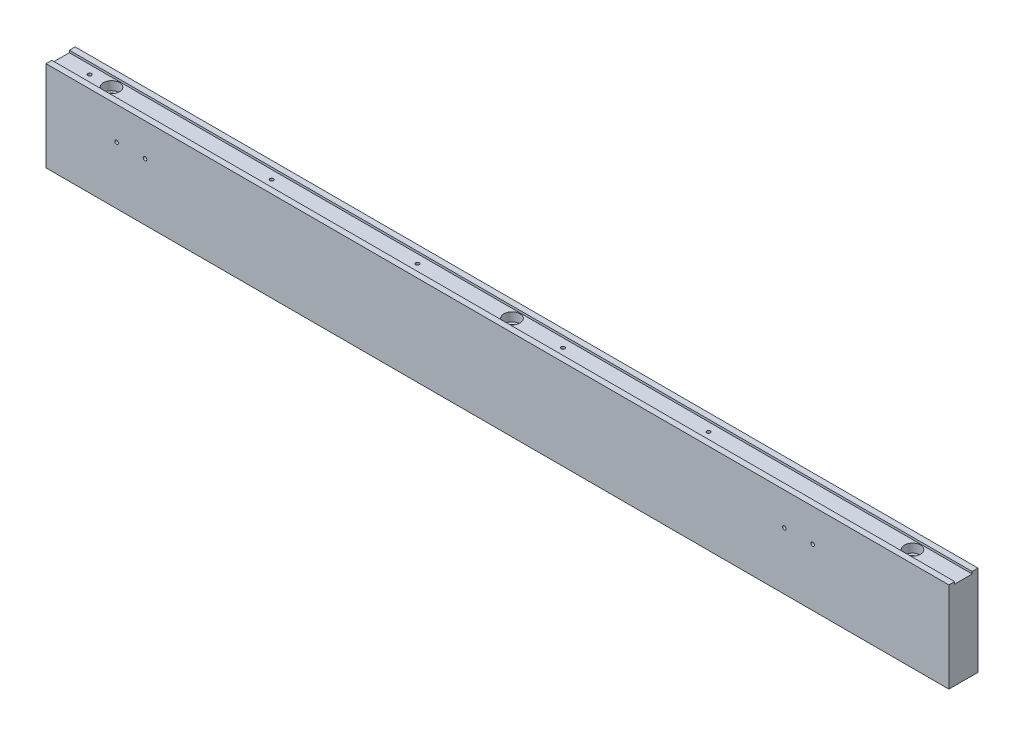
ISO-10303-21;
HEADER;
FILE_DESCRIPTION(('STEP AP214'),'2;1');
FILE_NAME('part.step','',(''),(''),'','','');
FILE_SCHEMA(('AUTOMOTIVE_DESIGN { 1 0 10303 214 1 1 1 1 }'));
ENDSEC;
DATA;
#1=APPLICATION_CONTEXT('core data for automotive mechanical design processes');
#2=APPLICATION_PROTOCOL_DEFINITION('international standard','automotive_design',2000,#1);
#3=PRODUCT_CONTEXT('',#1,'mechanical');
#4=PRODUCT('Part','Part','',(#3));
#5=PRODUCT_RELATED_PRODUCT_CATEGORY('part','',(#4));
#6=PRODUCT_DEFINITION_FORMATION('','',#4);
#7=PRODUCT_DEFINITION_CONTEXT('part definition',#1,'design');
#8=PRODUCT_DEFINITION('design','',#6,#7);
#9=PRODUCT_DEFINITION_SHAPE('','',#8);
#10=(LENGTH_UNIT() NAMED_UNIT(*) SI_UNIT(.MILLI.,.METRE.));
#11=(NAMED_UNIT(*) PLANE_ANGLE_UNIT() SI_UNIT($,.RADIAN.));
#12=(NAMED_UNIT(*) SI_UNIT($,.STERADIAN.) SOLID_ANGLE_UNIT());
#13=UNCERTAINTY_MEASURE_WITH_UNIT(LENGTH_MEASURE(1.E-05),#10,'distance_accuracy_value','');
#14=(GEOMETRIC_REPRESENTATION_CONTEXT(3) GLOBAL_UNCERTAINTY_ASSIGNED_CONTEXT((#13)) GLOBAL_UNIT_ASSIGNED_CONTEXT((#10,
#11,#12)) REPRESENTATION_CONTEXT('',''));
#15=CARTESIAN_POINT('',(0.,0.,0.));
#16=DIRECTION('',(0.,0.,1.));
#17=DIRECTION('',(1.,0.,0.));
#18=AXIS2_PLACEMENT_3D('',#15,#16,#17);
#19=CARTESIAN_POINT('',(0.,62.,20.));
#20=DIRECTION('',(0.,-1.,0.));
#21=DIRECTION('',(0.,0.,-1.));
#22=AXIS2_PLACEMENT_3D('',#19,#20,#21);
#23=PLANE('',#22);
#24=DIRECTION('',(0.,0.,-1.));
#25=VECTOR('',#24,1.);
#26=CARTESIAN_POINT('',(0.,62.,20.));
#27=LINE('',#26,#25);
#28=CARTESIAN_POINT('',(0.,62.,4.));
#29=VERTEX_POINT('',#28);
#30=CARTESIAN_POINT('',(0.,62.,0.));
#31=VERTEX_POINT('',#30);
#32=EDGE_CURVE('E83',#29,#31,#27,.T.);
#33=ORIENTED_EDGE('',*,*,#32,.F.);
#34=DIRECTION('',(1.,0.,0.));
#35=VECTOR('',#34,1.);
#36=CARTESIAN_POINT('',(0.,62.,4.));
#37=LINE('',#36,#35);
#38=CARTESIAN_POINT('',(620.,62.,4.));
#39=VERTEX_POINT('',#38);
#40=EDGE_CURVE('E244',#29,#39,#37,.T.);
#41=ORIENTED_EDGE('',*,*,#40,.T.);
#42=DIRECTION('',(0.,0.,-1.));
#43=VECTOR('',#42,1.);
#44=CARTESIAN_POINT('',(620.,62.,20.));
#45=LINE('',#44,#43);
#46=CARTESIAN_POINT('',(620.,62.,0.));
#47=VERTEX_POINT('',#46);
#48=EDGE_CURVE('E277',#39,#47,#45,.T.);
#49=ORIENTED_EDGE('',*,*,#48,.T.);
#50=DIRECTION('',(-1.,0.,0.));
#51=VECTOR('',#50,1.);
#52=CARTESIAN_POINT('',(0.,62.,0.));
#53=LINE('',#52,#51);
#54=EDGE_CURVE('E262',#47,#31,#53,.T.);
#55=ORIENTED_EDGE('',*,*,#54,.T.);
#56=EDGE_LOOP('',(#33,#41,#49,#55));
#57=FACE_BOUND('',#56,.T.);
#58=ADVANCED_FACE('F37',(#57),#23,.F.);
#59=CARTESIAN_POINT('',(0.,0.,20.));
#60=DIRECTION('',(1.,0.,0.));
#61=DIRECTION('',(0.,0.,-1.));
#62=AXIS2_PLACEMENT_3D('',#59,#60,#61);
#63=PLANE('',#62);
#64=DIRECTION('',(0.,0.,-1.));
#65=VECTOR('',#64,1.);
#66=CARTESIAN_POINT('',(0.,60.5,4.));
#67=LINE('',#66,#65);
#68=CARTESIAN_POINT('',(0.,60.5,16.));
#69=VERTEX_POINT('',#68);
#70=CARTESIAN_POINT('',(0.,60.5,4.));
#71=VERTEX_POINT('',#70);
#72=EDGE_CURVE('E241',#69,#71,#67,.T.);
#73=ORIENTED_EDGE('',*,*,#72,.T.);
#74=DIRECTION('',(0.,1.,0.));
#75=VECTOR('',#74,1.);
#76=CARTESIAN_POINT('',(0.,62.,4.));
#77=LINE('',#76,#75);
#78=EDGE_CURVE('E237',#71,#29,#77,.T.);
#79=ORIENTED_EDGE('',*,*,#78,.T.);
#80=ORIENTED_EDGE('',*,*,#32,.T.);
#81=DIRECTION('',(0.,-1.,0.));
#82=VECTOR('',#81,1.);
#83=CARTESIAN_POINT('',(0.,0.,0.));
#84=LINE('',#83,#82);
#85=CARTESIAN_POINT('',(0.,0.,0.));
#86=VERTEX_POINT('',#85);
#87=EDGE_CURVE('E253',#31,#86,#84,.T.);
#88=ORIENTED_EDGE('',*,*,#87,.T.);
#89=DIRECTION('',(0.,0.,-1.));
#90=VECTOR('',#89,1.);
#91=CARTESIAN_POINT('',(0.,0.,20.));
#92=LINE('',#91,#90);
#93=CARTESIAN_POINT('',(0.,0.,20.));
#94=VERTEX_POINT('',#93);
#95=EDGE_CURVE('E11',#94,#86,#92,.T.);
#96=ORIENTED_EDGE('',*,*,#95,.F.);
#97=DIRECTION('',(0.,-1.,0.));
#98=VECTOR('',#97,1.);
#99=CARTESIAN_POINT('',(0.,0.,20.));
#100=LINE('',#99,#98);
#101=CARTESIAN_POINT('',(0.,62.,20.));
#102=VERTEX_POINT('',#101);
#103=EDGE_CURVE('E260',#102,#94,#100,.T.);
#104=ORIENTED_EDGE('',*,*,#103,.F.);
#105=CARTESIAN_POINT('',(0.,62.,16.));
#106=VERTEX_POINT('',#105);
#107=EDGE_CURVE('E274',#102,#106,#27,.T.);
#108=ORIENTED_EDGE('',*,*,#107,.T.);
#109=DIRECTION('',(0.,-1.,0.));
#110=VECTOR('',#109,1.);
#111=CARTESIAN_POINT('',(0.,62.,16.));
#112=LINE('',#111,#110);
#113=EDGE_CURVE('E52',#106,#69,#112,.T.);
#114=ORIENTED_EDGE('',*,*,#113,.T.);
#115=EDGE_LOOP('',(#73,#79,#80,#88,#96,#104,#108,#114));
#116=FACE_BOUND('',#115,.T.);
#117=ADVANCED_FACE('F39',(#116),#63,.F.);
#118=CARTESIAN_POINT('',(0.,0.,20.));
#119=DIRECTION('',(0.,1.,0.));
#120=DIRECTION('',(0.,0.,1.));
#121=AXIS2_PLACEMENT_3D('',#118,#119,#120);
#122=PLANE('',#121);
#123=CARTESIAN_POINT('',(35.,0.,10.));
#124=DIRECTION('',(0.,1.,0.));
#125=DIRECTION('',(0.,0.,1.));
#126=AXIS2_PLACEMENT_3D('',#123,#124,#125);
#127=CIRCLE('',#126,3.49999999999998);
#128=CARTESIAN_POINT('',(35.,0.,13.5));
#129=VERTEX_POINT('',#128);
#130=EDGE_CURVE('E209',#129,#129,#127,.T.);
#131=ORIENTED_EDGE('',*,*,#130,.T.);
#132=EDGE_LOOP('',(#131));
#133=FACE_BOUND('',#132,.T.);
#134=CARTESIAN_POINT('',(310.,0.,10.));
#135=DIRECTION('',(0.,1.,0.));
#136=DIRECTION('',(0.,0.,1.));
#137=AXIS2_PLACEMENT_3D('',#134,#135,#136);
#138=CIRCLE('',#137,3.5);
#139=CARTESIAN_POINT('',(310.,0.,13.5));
#140=VERTEX_POINT('',#139);
#141=EDGE_CURVE('E221',#140,#140,#138,.T.);
#142=ORIENTED_EDGE('',*,*,#141,.T.);
#143=EDGE_LOOP('',(#142));
#144=FACE_BOUND('',#143,.T.);
#145=CARTESIAN_POINT('',(585.,0.,9.99999999999993));
#146=DIRECTION('',(0.,1.,0.));
#147=DIRECTION('',(0.,0.,1.));
#148=AXIS2_PLACEMENT_3D('',#145,#146,#147);
#149=CIRCLE('',#148,3.49999999999995);
#150=CARTESIAN_POINT('',(585.,0.,13.4999999999999));
#151=VERTEX_POINT('',#150);
#152=EDGE_CURVE('E233',#151,#151,#149,.T.);
#153=ORIENTED_EDGE('',*,*,#152,.T.);
#154=EDGE_LOOP('',(#153));
#155=FACE_BOUND('',#154,.T.);
#156=DIRECTION('',(1.,0.,0.));
#157=VECTOR('',#156,1.);
#158=CARTESIAN_POINT('',(0.,0.,0.));
#159=LINE('',#158,#157);
#160=CARTESIAN_POINT('',(620.,0.,0.));
#161=VERTEX_POINT('',#160);
#162=EDGE_CURVE('E268',#86,#161,#159,.T.);
#163=ORIENTED_EDGE('',*,*,#162,.T.);
#164=DIRECTION('',(0.,0.,-1.));
#165=VECTOR('',#164,1.);
#166=CARTESIAN_POINT('',(620.,0.,20.));
#167=LINE('',#166,#165);
#168=CARTESIAN_POINT('',(620.,0.,20.));
#169=VERTEX_POINT('',#168);
#170=EDGE_CURVE('E45',#169,#161,#167,.T.);
#171=ORIENTED_EDGE('',*,*,#170,.F.);
#172=DIRECTION('',(1.,0.,0.));
#173=VECTOR('',#172,1.);
#174=CARTESIAN_POINT('',(0.,0.,20.));
#175=LINE('',#174,#173);
#176=EDGE_CURVE('E90',#94,#169,#175,.T.);
#177=ORIENTED_EDGE('',*,*,#176,.F.);
#178=ORIENTED_EDGE('',*,*,#95,.T.);
#179=EDGE_LOOP('',(#163,#171,#177,#178));
#180=FACE_BOUND('',#179,.T.);
#181=ADVANCED_FACE('F325',(#133,#144,#155,#180),#122,.F.);
#182=CARTESIAN_POINT('',(620.,0.,20.));
#183=DIRECTION('',(-1.,0.,0.));
#184=DIRECTION('',(0.,0.,1.));
#185=AXIS2_PLACEMENT_3D('',#182,#183,#184);
#186=PLANE('',#185);
#187=ORIENTED_EDGE('',*,*,#48,.F.);
#188=DIRECTION('',(0.,1.,0.));
#189=VECTOR('',#188,1.);
#190=CARTESIAN_POINT('',(620.,62.,4.));
#191=LINE('',#190,#189);
#192=CARTESIAN_POINT('',(620.,60.5,4.));
#193=VERTEX_POINT('',#192);
#194=EDGE_CURVE('E236',#193,#39,#191,.T.);
#195=ORIENTED_EDGE('',*,*,#194,.F.);
#196=DIRECTION('',(0.,0.,-1.));
#197=VECTOR('',#196,1.);
#198=CARTESIAN_POINT('',(620.,60.5,4.));
#199=LINE('',#198,#197);
#200=CARTESIAN_POINT('',(620.,60.5,16.));
#201=VERTEX_POINT('',#200);
#202=EDGE_CURVE('E239',#201,#193,#199,.T.);
#203=ORIENTED_EDGE('',*,*,#202,.F.);
#204=DIRECTION('',(0.,-1.,0.));
#205=VECTOR('',#204,1.);
#206=CARTESIAN_POINT('',(620.,62.,16.));
#207=LINE('',#206,#205);
#208=CARTESIAN_POINT('',(620.,62.,16.));
#209=VERTEX_POINT('',#208);
#210=EDGE_CURVE('E246',#209,#201,#207,.T.);
#211=ORIENTED_EDGE('',*,*,#210,.F.);
#212=CARTESIAN_POINT('',(620.,62.,20.));
#213=VERTEX_POINT('',#212);
#214=EDGE_CURVE('E278',#213,#209,#45,.T.);
#215=ORIENTED_EDGE('',*,*,#214,.F.);
#216=DIRECTION('',(0.,1.,0.));
#217=VECTOR('',#216,1.);
#218=CARTESIAN_POINT('',(620.,0.,20.));
#219=LINE('',#218,#217);
#220=EDGE_CURVE('E264',#169,#213,#219,.T.);
#221=ORIENTED_EDGE('',*,*,#220,.F.);
#222=ORIENTED_EDGE('',*,*,#170,.T.);
#223=DIRECTION('',(0.,1.,0.));
#224=VECTOR('',#223,1.);
#225=CARTESIAN_POINT('',(620.,0.,0.));
#226=LINE('',#225,#224);
#227=EDGE_CURVE('E270',#161,#47,#226,.T.);
#228=ORIENTED_EDGE('',*,*,#227,.T.);
#229=EDGE_LOOP('',(#187,#195,#203,#211,#215,#221,#222,#228));
#230=FACE_BOUND('',#229,.T.);
#231=ADVANCED_FACE('F285',(#230),#186,.F.);
#232=ORIENTED_EDGE('',*,*,#214,.T.);
#233=DIRECTION('',(1.,0.,0.));
#234=VECTOR('',#233,1.);
#235=CARTESIAN_POINT('',(0.,62.,16.));
#236=LINE('',#235,#234);
#237=EDGE_CURVE('E256',#106,#209,#236,.T.);
#238=ORIENTED_EDGE('',*,*,#237,.F.);
#239=ORIENTED_EDGE('',*,*,#107,.F.);
#240=DIRECTION('',(-1.,0.,0.));
#241=VECTOR('',#240,1.);
#242=CARTESIAN_POINT('',(0.,62.,20.));
#243=LINE('',#242,#241);
#244=EDGE_CURVE('E61',#213,#102,#243,.T.);
#245=ORIENTED_EDGE('',*,*,#244,.F.);
#246=EDGE_LOOP('',(#232,#238,#239,#245));
#247=FACE_BOUND('',#246,.T.);
#248=ADVANCED_FACE('F303',(#247),#23,.F.);
#249=CARTESIAN_POINT('',(0.,62.,20.));
#250=DIRECTION('',(0.,0.,-1.));
#251=DIRECTION('',(-1.,0.,0.));
#252=AXIS2_PLACEMENT_3D('',#249,#250,#251);
#253=PLANE('',#252);
#254=CARTESIAN_POINT('',(48.5,39.5,20.));
#255=DIRECTION('',(0.,0.,1.));
#256=DIRECTION('',(1.,0.,0.));
#257=AXIS2_PLACEMENT_3D('',#254,#255,#256);
#258=CIRCLE('',#257,1.25);
#259=CARTESIAN_POINT('',(49.75,39.5,20.));
#260=VERTEX_POINT('',#259);
#261=EDGE_CURVE('E148',#260,#260,#258,.T.);
#262=ORIENTED_EDGE('',*,*,#261,.F.);
#263=EDGE_LOOP('',(#262));
#264=FACE_BOUND('',#263,.T.);
#265=CARTESIAN_POINT('',(68.,39.5,20.));
#266=DIRECTION('',(0.,0.,1.));
#267=DIRECTION('',(1.,0.,0.));
#268=AXIS2_PLACEMENT_3D('',#265,#266,#267);
#269=CIRCLE('',#268,1.25);
#270=CARTESIAN_POINT('',(69.25,39.5,20.));
#271=VERTEX_POINT('',#270);
#272=EDGE_CURVE('E147',#271,#271,#269,.T.);
#273=ORIENTED_EDGE('',*,*,#272,.F.);
#274=EDGE_LOOP('',(#273));
#275=FACE_BOUND('',#274,.T.);
#276=CARTESIAN_POINT('',(507.,39.5,20.));
#277=DIRECTION('',(0.,0.,1.));
#278=DIRECTION('',(1.,0.,0.));
#279=AXIS2_PLACEMENT_3D('',#276,#277,#278);
#280=CIRCLE('',#279,1.24999999999997);
#281=CARTESIAN_POINT('',(508.25,39.5,20.));
#282=VERTEX_POINT('',#281);
#283=EDGE_CURVE('E158',#282,#282,#280,.T.);
#284=ORIENTED_EDGE('',*,*,#283,.F.);
#285=EDGE_LOOP('',(#284));
#286=FACE_BOUND('',#285,.T.);
#287=CARTESIAN_POINT('',(526.5,39.5,20.));
#288=DIRECTION('',(0.,0.,1.));
#289=DIRECTION('',(1.,0.,0.));
#290=AXIS2_PLACEMENT_3D('',#287,#288,#289);
#291=CIRCLE('',#290,1.24999999999997);
#292=CARTESIAN_POINT('',(527.75,39.5,20.));
#293=VERTEX_POINT('',#292);
#294=EDGE_CURVE('E164',#293,#293,#291,.T.);
#295=ORIENTED_EDGE('',*,*,#294,.F.);
#296=EDGE_LOOP('',(#295));
#297=FACE_BOUND('',#296,.T.);
#298=ORIENTED_EDGE('',*,*,#103,.T.);
#299=ORIENTED_EDGE('',*,*,#176,.T.);
#300=ORIENTED_EDGE('',*,*,#220,.T.);
#301=ORIENTED_EDGE('',*,*,#244,.T.);
#302=EDGE_LOOP('',(#298,#299,#300,#301));
#303=FACE_BOUND('',#302,.T.);
#304=ADVANCED_FACE('F306',(#264,#275,#286,#297,#303),#253,.F.);
#305=CARTESIAN_POINT('',(0.,62.,0.));
#306=DIRECTION('',(0.,0.,-1.));
#307=DIRECTION('',(-1.,0.,0.));
#308=AXIS2_PLACEMENT_3D('',#305,#306,#307);
#309=PLANE('',#308);
#310=ORIENTED_EDGE('',*,*,#87,.F.);
#311=ORIENTED_EDGE('',*,*,#54,.F.);
#312=ORIENTED_EDGE('',*,*,#227,.F.);
#313=ORIENTED_EDGE('',*,*,#162,.F.);
#314=EDGE_LOOP('',(#310,#311,#312,#313));
#315=FACE_BOUND('',#314,.T.);
#316=ADVANCED_FACE('F290',(#315),#309,.T.);
#317=CARTESIAN_POINT('',(0.,62.,4.));
#318=DIRECTION('',(0.,0.,-1.));
#319=DIRECTION('',(0.,1.,0.));
#320=AXIS2_PLACEMENT_3D('',#317,#318,#319);
#321=PLANE('',#320);
#322=ORIENTED_EDGE('',*,*,#194,.T.);
#323=ORIENTED_EDGE('',*,*,#40,.F.);
#324=ORIENTED_EDGE('',*,*,#78,.F.);
#325=DIRECTION('',(1.,0.,0.));
#326=VECTOR('',#325,1.);
#327=CARTESIAN_POINT('',(0.,60.5,4.));
#328=LINE('',#327,#326);
#329=EDGE_CURVE('E251',#71,#193,#328,.T.);
#330=ORIENTED_EDGE('',*,*,#329,.T.);
#331=EDGE_LOOP('',(#322,#323,#324,#330));
#332=FACE_BOUND('',#331,.T.);
#333=ADVANCED_FACE('F296',(#332),#321,.F.);
#334=CARTESIAN_POINT('',(0.,60.5,4.));
#335=DIRECTION('',(0.,-1.,0.));
#336=DIRECTION('',(0.,0.,-1.));
#337=AXIS2_PLACEMENT_3D('',#334,#335,#336);
#338=PLANE('',#337);
#339=CARTESIAN_POINT('',(19.9999999999999,60.5,10.));
#340=DIRECTION('',(0.,1.,0.));
#341=DIRECTION('',(0.,0.,1.));
#342=AXIS2_PLACEMENT_3D('',#339,#340,#341);
#343=CIRCLE('',#342,1.25);
#344=CARTESIAN_POINT('',(19.9999999999999,60.5,11.25));
#345=VERTEX_POINT('',#344);
#346=EDGE_CURVE('E170',#345,#345,#343,.T.);
#347=ORIENTED_EDGE('',*,*,#346,.F.);
#348=EDGE_LOOP('',(#347));
#349=FACE_BOUND('',#348,.T.);
#350=CARTESIAN_POINT('',(445.,60.5,10.));
#351=DIRECTION('',(0.,1.,0.));
#352=DIRECTION('',(0.,0.,1.));
#353=AXIS2_PLACEMENT_3D('',#350,#351,#352);
#354=CIRCLE('',#353,1.24999999999997);
#355=CARTESIAN_POINT('',(445.,60.5,11.25));
#356=VERTEX_POINT('',#355);
#357=EDGE_CURVE('E176',#356,#356,#354,.T.);
#358=ORIENTED_EDGE('',*,*,#357,.F.);
#359=EDGE_LOOP('',(#358));
#360=FACE_BOUND('',#359,.T.);
#361=CARTESIAN_POINT('',(345.,60.5,10.));
#362=DIRECTION('',(0.,1.,0.));
#363=DIRECTION('',(0.,0.,1.));
#364=AXIS2_PLACEMENT_3D('',#361,#362,#363);
#365=CIRCLE('',#364,1.24999999999997);
#366=CARTESIAN_POINT('',(345.,60.5,11.25));
#367=VERTEX_POINT('',#366);
#368=EDGE_CURVE('E182',#367,#367,#365,.T.);
#369=ORIENTED_EDGE('',*,*,#368,.F.);
#370=EDGE_LOOP('',(#369));
#371=FACE_BOUND('',#370,.T.);
#372=CARTESIAN_POINT('',(245.,60.5,10.));
#373=DIRECTION('',(0.,1.,0.));
#374=DIRECTION('',(0.,0.,1.));
#375=AXIS2_PLACEMENT_3D('',#372,#373,#374);
#376=CIRCLE('',#375,1.25);
#377=CARTESIAN_POINT('',(245.,60.5,11.25));
#378=VERTEX_POINT('',#377);
#379=EDGE_CURVE('E188',#378,#378,#376,.T.);
#380=ORIENTED_EDGE('',*,*,#379,.F.);
#381=EDGE_LOOP('',(#380));
#382=FACE_BOUND('',#381,.T.);
#383=CARTESIAN_POINT('',(145.,60.5,10.));
#384=DIRECTION('',(0.,1.,0.));
#385=DIRECTION('',(0.,0.,1.));
#386=AXIS2_PLACEMENT_3D('',#383,#384,#385);
#387=CIRCLE('',#386,1.25);
#388=CARTESIAN_POINT('',(145.,60.5,11.25));
#389=VERTEX_POINT('',#388);
#390=EDGE_CURVE('E194',#389,#389,#387,.T.);
#391=ORIENTED_EDGE('',*,*,#390,.F.);
#392=EDGE_LOOP('',(#391));
#393=FACE_BOUND('',#392,.T.);
#394=CARTESIAN_POINT('',(35.,60.5,10.));
#395=DIRECTION('',(0.,1.,0.));
#396=DIRECTION('',(0.,0.,1.));
#397=AXIS2_PLACEMENT_3D('',#394,#395,#396);
#398=CIRCLE('',#397,5.5);
#399=CARTESIAN_POINT('',(35.,60.5,15.5));
#400=VERTEX_POINT('',#399);
#401=EDGE_CURVE('E200',#400,#400,#398,.T.);
#402=ORIENTED_EDGE('',*,*,#401,.F.);
#403=EDGE_LOOP('',(#402));
#404=FACE_BOUND('',#403,.T.);
#405=CARTESIAN_POINT('',(310.,60.5,10.));
#406=DIRECTION('',(0.,1.,0.));
#407=DIRECTION('',(0.,0.,1.));
#408=AXIS2_PLACEMENT_3D('',#405,#406,#407);
#409=CIRCLE('',#408,5.50000000000001);
#410=CARTESIAN_POINT('',(310.,60.5,15.5));
#411=VERTEX_POINT('',#410);
#412=EDGE_CURVE('E212',#411,#411,#409,.T.);
#413=ORIENTED_EDGE('',*,*,#412,.F.);
#414=EDGE_LOOP('',(#413));
#415=FACE_BOUND('',#414,.T.);
#416=CARTESIAN_POINT('',(585.,60.5,9.99999999999993));
#417=DIRECTION('',(0.,1.,0.));
#418=DIRECTION('',(0.,0.,1.));
#419=AXIS2_PLACEMENT_3D('',#416,#417,#418);
#420=CIRCLE('',#419,5.49999999999995);
#421=CARTESIAN_POINT('',(585.,60.5,15.4999999999999));
#422=VERTEX_POINT('',#421);
#423=EDGE_CURVE('E224',#422,#422,#420,.T.);
#424=ORIENTED_EDGE('',*,*,#423,.F.);
#425=EDGE_LOOP('',(#424));
#426=FACE_BOUND('',#425,.T.);
#427=ORIENTED_EDGE('',*,*,#202,.T.);
#428=ORIENTED_EDGE('',*,*,#329,.F.);
#429=ORIENTED_EDGE('',*,*,#72,.F.);
#430=DIRECTION('',(1.,0.,0.));
#431=VECTOR('',#430,1.);
#432=CARTESIAN_POINT('',(0.,60.5,16.));
#433=LINE('',#432,#431);
#434=EDGE_CURVE('E254',#69,#201,#433,.T.);
#435=ORIENTED_EDGE('',*,*,#434,.T.);
#436=EDGE_LOOP('',(#427,#428,#429,#435));
#437=FACE_BOUND('',#436,.T.);
#438=ADVANCED_FACE('F300',(#349,#360,#371,#382,#393,#404,#415,#426,#437),#338,.F.);
#439=CARTESIAN_POINT('',(0.,62.,16.));
#440=DIRECTION('',(0.,0.,1.));
#441=DIRECTION('',(1.,0.,0.));
#442=AXIS2_PLACEMENT_3D('',#439,#440,#441);
#443=PLANE('',#442);
#444=ORIENTED_EDGE('',*,*,#210,.T.);
#445=ORIENTED_EDGE('',*,*,#434,.F.);
#446=ORIENTED_EDGE('',*,*,#113,.F.);
#447=ORIENTED_EDGE('',*,*,#237,.T.);
#448=EDGE_LOOP('',(#444,#445,#446,#447));
#449=FACE_BOUND('',#448,.T.);
#450=ADVANCED_FACE('F301',(#449),#443,.F.);
#451=CARTESIAN_POINT('',(585.,60.5,9.99999999999993));
#452=DIRECTION('',(0.,1.,0.));
#453=DIRECTION('',(0.,0.,1.));
#454=AXIS2_PLACEMENT_3D('',#451,#452,#453);
#455=CYLINDRICAL_SURFACE('',#454,3.5);
#456=ORIENTED_EDGE('',*,*,#152,.F.);
#457=EDGE_LOOP('',(#456));
#458=FACE_BOUND('',#457,.T.);
#459=CARTESIAN_POINT('',(585.,54.5,9.99999999999993));
#460=DIRECTION('',(0.,1.,0.));
#461=DIRECTION('',(0.,0.,1.));
#462=AXIS2_PLACEMENT_3D('',#459,#460,#461);
#463=CIRCLE('',#462,3.50000000000006);
#464=CARTESIAN_POINT('',(585.,54.5,13.5));
#465=VERTEX_POINT('',#464);
#466=EDGE_CURVE('E230',#465,#465,#463,.T.);
#467=ORIENTED_EDGE('',*,*,#466,.T.);
#468=EDGE_LOOP('',(#467));
#469=FACE_BOUND('',#468,.T.);
#470=ADVANCED_FACE('F340',(#458,#469),#455,.F.);
#471=CARTESIAN_POINT('',(588.5,54.5,9.99999999999993));
#472=DIRECTION('',(0.,-1.,0.));
#473=DIRECTION('',(0.,0.,-1.));
#474=AXIS2_PLACEMENT_3D('',#471,#472,#473);
#475=PLANE('',#474);
#476=ORIENTED_EDGE('',*,*,#466,.F.);
#477=EDGE_LOOP('',(#476));
#478=FACE_BOUND('',#477,.T.);
#479=CARTESIAN_POINT('',(585.,54.5,9.99999999999993));
#480=DIRECTION('',(0.,1.,0.));
#481=DIRECTION('',(0.,0.,1.));
#482=AXIS2_PLACEMENT_3D('',#479,#480,#481);
#483=CIRCLE('',#482,5.49999999999995);
#484=CARTESIAN_POINT('',(585.,54.5,15.4999999999999));
#485=VERTEX_POINT('',#484);
#486=EDGE_CURVE('E227',#485,#485,#483,.T.);
#487=ORIENTED_EDGE('',*,*,#486,.T.);
#488=EDGE_LOOP('',(#487));
#489=FACE_BOUND('',#488,.T.);
#490=ADVANCED_FACE('F343',(#478,#489),#475,.F.);
#491=CARTESIAN_POINT('',(585.,60.5,9.99999999999993));
#492=DIRECTION('',(0.,1.,0.));
#493=DIRECTION('',(0.,0.,1.));
#494=AXIS2_PLACEMENT_3D('',#491,#492,#493);
#495=CYLINDRICAL_SURFACE('',#494,5.49999999999995);
#496=ORIENTED_EDGE('',*,*,#486,.F.);
#497=EDGE_LOOP('',(#496));
#498=FACE_BOUND('',#497,.T.);
#499=ORIENTED_EDGE('',*,*,#423,.T.);
#500=EDGE_LOOP('',(#499));
#501=FACE_BOUND('',#500,.T.);
#502=ADVANCED_FACE('F349',(#498,#501),#495,.F.);
#503=CARTESIAN_POINT('',(310.,60.5,10.));
#504=DIRECTION('',(0.,1.,0.));
#505=DIRECTION('',(0.,0.,1.));
#506=AXIS2_PLACEMENT_3D('',#503,#504,#505);
#507=CYLINDRICAL_SURFACE('',#506,3.5);
#508=ORIENTED_EDGE('',*,*,#141,.F.);
#509=EDGE_LOOP('',(#508));
#510=FACE_BOUND('',#509,.T.);
#511=CARTESIAN_POINT('',(310.,54.5,10.));
#512=DIRECTION('',(0.,1.,0.));
#513=DIRECTION('',(0.,0.,1.));
#514=AXIS2_PLACEMENT_3D('',#511,#512,#513);
#515=CIRCLE('',#514,3.5);
#516=CARTESIAN_POINT('',(310.,54.5,13.5));
#517=VERTEX_POINT('',#516);
#518=EDGE_CURVE('E218',#517,#517,#515,.T.);
#519=ORIENTED_EDGE('',*,*,#518,.T.);
#520=EDGE_LOOP('',(#519));
#521=FACE_BOUND('',#520,.T.);
#522=ADVANCED_FACE('F355',(#510,#521),#507,.F.);
#523=CARTESIAN_POINT('',(313.5,54.5,10.));
#524=DIRECTION('',(0.,-1.,0.));
#525=DIRECTION('',(0.,0.,-1.));
#526=AXIS2_PLACEMENT_3D('',#523,#524,#525);
#527=PLANE('',#526);
#528=ORIENTED_EDGE('',*,*,#518,.F.);
#529=EDGE_LOOP('',(#528));
#530=FACE_BOUND('',#529,.T.);
#531=CARTESIAN_POINT('',(310.,54.5,10.));
#532=DIRECTION('',(0.,1.,0.));
#533=DIRECTION('',(0.,0.,1.));
#534=AXIS2_PLACEMENT_3D('',#531,#532,#533);
#535=CIRCLE('',#534,5.50000000000001);
#536=CARTESIAN_POINT('',(310.,54.5,15.5));
#537=VERTEX_POINT('',#536);
#538=EDGE_CURVE('E215',#537,#537,#535,.T.);
#539=ORIENTED_EDGE('',*,*,#538,.T.);
#540=EDGE_LOOP('',(#539));
#541=FACE_BOUND('',#540,.T.);
#542=ADVANCED_FACE('F374',(#530,#541),#527,.F.);
#543=CARTESIAN_POINT('',(310.,60.5,10.));
#544=DIRECTION('',(0.,1.,0.));
#545=DIRECTION('',(0.,0.,1.));
#546=AXIS2_PLACEMENT_3D('',#543,#544,#545);
#547=CYLINDRICAL_SURFACE('',#546,5.50000000000001);
#548=ORIENTED_EDGE('',*,*,#538,.F.);
#549=EDGE_LOOP('',(#548));
#550=FACE_BOUND('',#549,.T.);
#551=ORIENTED_EDGE('',*,*,#412,.T.);
#552=EDGE_LOOP('',(#551));
#553=FACE_BOUND('',#552,.T.);
#554=ADVANCED_FACE('F378',(#550,#553),#547,.F.);
#555=CARTESIAN_POINT('',(35.,60.5,10.));
#556=DIRECTION('',(0.,1.,0.));
#557=DIRECTION('',(0.,0.,1.));
#558=AXIS2_PLACEMENT_3D('',#555,#556,#557);
#559=CYLINDRICAL_SURFACE('',#558,3.49999999999999);
#560=ORIENTED_EDGE('',*,*,#130,.F.);
#561=EDGE_LOOP('',(#560));
#562=FACE_BOUND('',#561,.T.);
#563=CARTESIAN_POINT('',(35.,54.5,10.));
#564=DIRECTION('',(0.,1.,0.));
#565=DIRECTION('',(0.,0.,1.));
#566=AXIS2_PLACEMENT_3D('',#563,#564,#565);
#567=CIRCLE('',#566,3.5);
#568=CARTESIAN_POINT('',(35.,54.5,13.5));
#569=VERTEX_POINT('',#568);
#570=EDGE_CURVE('E206',#569,#569,#567,.T.);
#571=ORIENTED_EDGE('',*,*,#570,.T.);
#572=EDGE_LOOP('',(#571));
#573=FACE_BOUND('',#572,.T.);
#574=ADVANCED_FACE('F382',(#562,#573),#559,.F.);
#575=CARTESIAN_POINT('',(38.5,54.5,10.));
#576=DIRECTION('',(0.,-1.,0.));
#577=DIRECTION('',(0.,0.,-1.));
#578=AXIS2_PLACEMENT_3D('',#575,#576,#577);
#579=PLANE('',#578);
#580=ORIENTED_EDGE('',*,*,#570,.F.);
#581=EDGE_LOOP('',(#580));
#582=FACE_BOUND('',#581,.T.);
#583=CARTESIAN_POINT('',(35.,54.5,10.));
#584=DIRECTION('',(0.,1.,0.));
#585=DIRECTION('',(0.,0.,1.));
#586=AXIS2_PLACEMENT_3D('',#583,#584,#585);
#587=CIRCLE('',#586,5.5);
#588=CARTESIAN_POINT('',(35.,54.5,15.5));
#589=VERTEX_POINT('',#588);
#590=EDGE_CURVE('E203',#589,#589,#587,.T.);
#591=ORIENTED_EDGE('',*,*,#590,.T.);
#592=EDGE_LOOP('',(#591));
#593=FACE_BOUND('',#592,.T.);
#594=ADVANCED_FACE('F386',(#582,#593),#579,.F.);
#595=CARTESIAN_POINT('',(35.,60.5,10.));
#596=DIRECTION('',(0.,1.,0.));
#597=DIRECTION('',(0.,0.,1.));
#598=AXIS2_PLACEMENT_3D('',#595,#596,#597);
#599=CYLINDRICAL_SURFACE('',#598,5.5);
#600=ORIENTED_EDGE('',*,*,#590,.F.);
#601=EDGE_LOOP('',(#600));
#602=FACE_BOUND('',#601,.T.);
#603=ORIENTED_EDGE('',*,*,#401,.T.);
#604=EDGE_LOOP('',(#603));
#605=FACE_BOUND('',#604,.T.);
#606=ADVANCED_FACE('F390',(#602,#605),#599,.F.);
#607=CARTESIAN_POINT('',(145.,53.,10.));
#608=DIRECTION('',(0.,1.,0.));
#609=DIRECTION('',(0.,0.,1.));
#610=AXIS2_PLACEMENT_3D('',#607,#608,#609);
#611=CONICAL_SURFACE('',#610,1.25,1.02974425867666);
#612=CARTESIAN_POINT('',(145.,52.2489242262155,10.));
#613=VERTEX_POINT('',#612);
#614=VERTEX_LOOP('',#613);
#615=FACE_BOUND('',#614,.T.);
#616=CARTESIAN_POINT('',(145.,53.,10.));
#617=DIRECTION('',(0.,1.,0.));
#618=DIRECTION('',(0.,0.,1.));
#619=AXIS2_PLACEMENT_3D('',#616,#617,#618);
#620=CIRCLE('',#619,1.25);
#621=CARTESIAN_POINT('',(145.,53.,11.25));
#622=VERTEX_POINT('',#621);
#623=EDGE_CURVE('E197',#622,#622,#620,.T.);
#624=ORIENTED_EDGE('',*,*,#623,.T.);
#625=EDGE_LOOP('',(#624));
#626=FACE_BOUND('',#625,.T.);
#627=ADVANCED_FACE('F394',(#615,#626),#611,.F.);
#628=CARTESIAN_POINT('',(145.,60.5,10.));
#629=DIRECTION('',(0.,1.,0.));
#630=DIRECTION('',(0.,0.,1.));
#631=AXIS2_PLACEMENT_3D('',#628,#629,#630);
#632=CYLINDRICAL_SURFACE('',#631,1.25);
#633=ORIENTED_EDGE('',*,*,#623,.F.);
#634=EDGE_LOOP('',(#633));
#635=FACE_BOUND('',#634,.T.);
#636=ORIENTED_EDGE('',*,*,#390,.T.);
#637=EDGE_LOOP('',(#636));
#638=FACE_BOUND('',#637,.T.);
#639=ADVANCED_FACE('F398',(#635,#638),#632,.F.);
#640=CARTESIAN_POINT('',(245.,53.,10.));
#641=DIRECTION('',(0.,1.,0.));
#642=DIRECTION('',(0.,0.,1.));
#643=AXIS2_PLACEMENT_3D('',#640,#641,#642);
#644=CONICAL_SURFACE('',#643,1.25,1.02974425867666);
#645=CARTESIAN_POINT('',(245.,52.2489242262155,10.));
#646=VERTEX_POINT('',#645);
#647=VERTEX_LOOP('',#646);
#648=FACE_BOUND('',#647,.T.);
#649=CARTESIAN_POINT('',(245.,53.,10.));
#650=DIRECTION('',(0.,1.,0.));
#651=DIRECTION('',(0.,0.,1.));
#652=AXIS2_PLACEMENT_3D('',#649,#650,#651);
#653=CIRCLE('',#652,1.25);
#654=CARTESIAN_POINT('',(245.,53.,11.25));
#655=VERTEX_POINT('',#654);
#656=EDGE_CURVE('E191',#655,#655,#653,.T.);
#657=ORIENTED_EDGE('',*,*,#656,.T.);
#658=EDGE_LOOP('',(#657));
#659=FACE_BOUND('',#658,.T.);
#660=ADVANCED_FACE('F402',(#648,#659),#644,.F.);
#661=CARTESIAN_POINT('',(245.,60.5,10.));
#662=DIRECTION('',(0.,1.,0.));
#663=DIRECTION('',(0.,0.,1.));
#664=AXIS2_PLACEMENT_3D('',#661,#662,#663);
#665=CYLINDRICAL_SURFACE('',#664,1.25);
#666=ORIENTED_EDGE('',*,*,#656,.F.);
#667=EDGE_LOOP('',(#666));
#668=FACE_BOUND('',#667,.T.);
#669=ORIENTED_EDGE('',*,*,#379,.T.);
#670=EDGE_LOOP('',(#669));
#671=FACE_BOUND('',#670,.T.);
#672=ADVANCED_FACE('F406',(#668,#671),#665,.F.);
#673=CARTESIAN_POINT('',(345.,53.,10.));
#674=DIRECTION('',(0.,1.,0.));
#675=DIRECTION('',(0.,0.,1.));
#676=AXIS2_PLACEMENT_3D('',#673,#674,#675);
#677=CONICAL_SURFACE('',#676,1.24999999999997,1.02974425867665);
#678=CARTESIAN_POINT('',(345.,52.2489242262155,10.));
#679=VERTEX_POINT('',#678);
#680=VERTEX_LOOP('',#679);
#681=FACE_BOUND('',#680,.T.);
#682=CARTESIAN_POINT('',(345.,53.,10.));
#683=DIRECTION('',(0.,1.,0.));
#684=DIRECTION('',(0.,0.,1.));
#685=AXIS2_PLACEMENT_3D('',#682,#683,#684);
#686=CIRCLE('',#685,1.24999999999997);
#687=CARTESIAN_POINT('',(345.,53.,11.25));
#688=VERTEX_POINT('',#687);
#689=EDGE_CURVE('E185',#688,#688,#686,.T.);
#690=ORIENTED_EDGE('',*,*,#689,.T.);
#691=EDGE_LOOP('',(#690));
#692=FACE_BOUND('',#691,.T.);
#693=ADVANCED_FACE('F410',(#681,#692),#677,.F.);
#694=CARTESIAN_POINT('',(345.,60.5,10.));
#695=DIRECTION('',(0.,1.,0.));
#696=DIRECTION('',(0.,0.,1.));
#697=AXIS2_PLACEMENT_3D('',#694,#695,#696);
#698=CYLINDRICAL_SURFACE('',#697,1.24999999999997);
#699=ORIENTED_EDGE('',*,*,#689,.F.);
#700=EDGE_LOOP('',(#699));
#701=FACE_BOUND('',#700,.T.);
#702=ORIENTED_EDGE('',*,*,#368,.T.);
#703=EDGE_LOOP('',(#702));
#704=FACE_BOUND('',#703,.T.);
#705=ADVANCED_FACE('F414',(#701,#704),#698,.F.);
#706=CARTESIAN_POINT('',(445.,53.,10.));
#707=DIRECTION('',(0.,1.,0.));
#708=DIRECTION('',(0.,0.,1.));
#709=AXIS2_PLACEMENT_3D('',#706,#707,#708);
#710=CONICAL_SURFACE('',#709,1.24999999999997,1.02974425867665);
#711=CARTESIAN_POINT('',(445.,52.2489242262155,10.));
#712=VERTEX_POINT('',#711);
#713=VERTEX_LOOP('',#712);
#714=FACE_BOUND('',#713,.T.);
#715=CARTESIAN_POINT('',(445.,53.,10.));
#716=DIRECTION('',(0.,1.,0.));
#717=DIRECTION('',(0.,0.,1.));
#718=AXIS2_PLACEMENT_3D('',#715,#716,#717);
#719=CIRCLE('',#718,1.24999999999997);
#720=CARTESIAN_POINT('',(445.,53.,11.25));
#721=VERTEX_POINT('',#720);
#722=EDGE_CURVE('E179',#721,#721,#719,.T.);
#723=ORIENTED_EDGE('',*,*,#722,.T.);
#724=EDGE_LOOP('',(#723));
#725=FACE_BOUND('',#724,.T.);
#726=ADVANCED_FACE('F418',(#714,#725),#710,.F.);
#727=CARTESIAN_POINT('',(445.,60.5,10.));
#728=DIRECTION('',(0.,1.,0.));
#729=DIRECTION('',(0.,0.,1.));
#730=AXIS2_PLACEMENT_3D('',#727,#728,#729);
#731=CYLINDRICAL_SURFACE('',#730,1.24999999999997);
#732=ORIENTED_EDGE('',*,*,#722,.F.);
#733=EDGE_LOOP('',(#732));
#734=FACE_BOUND('',#733,.T.);
#735=ORIENTED_EDGE('',*,*,#357,.T.);
#736=EDGE_LOOP('',(#735));
#737=FACE_BOUND('',#736,.T.);
#738=ADVANCED_FACE('F422',(#734,#737),#731,.F.);
#739=CARTESIAN_POINT('',(19.9999999999999,53.,10.));
#740=DIRECTION('',(0.,1.,0.));
#741=DIRECTION('',(0.,0.,1.));
#742=AXIS2_PLACEMENT_3D('',#739,#740,#741);
#743=CONICAL_SURFACE('',#742,1.25,1.02974425867665);
#744=CARTESIAN_POINT('',(19.9999999999999,52.2489242262155,10.));
#745=VERTEX_POINT('',#744);
#746=VERTEX_LOOP('',#745);
#747=FACE_BOUND('',#746,.T.);
#748=CARTESIAN_POINT('',(19.9999999999999,53.,10.));
#749=DIRECTION('',(0.,1.,0.));
#750=DIRECTION('',(0.,0.,1.));
#751=AXIS2_PLACEMENT_3D('',#748,#749,#750);
#752=CIRCLE('',#751,1.25);
#753=CARTESIAN_POINT('',(19.9999999999999,53.,11.25));
#754=VERTEX_POINT('',#753);
#755=EDGE_CURVE('E173',#754,#754,#752,.T.);
#756=ORIENTED_EDGE('',*,*,#755,.T.);
#757=EDGE_LOOP('',(#756));
#758=FACE_BOUND('',#757,.T.);
#759=ADVANCED_FACE('F426',(#747,#758),#743,.F.);
#760=CARTESIAN_POINT('',(19.9999999999999,60.5,10.));
#761=DIRECTION('',(0.,1.,0.));
#762=DIRECTION('',(0.,0.,1.));
#763=AXIS2_PLACEMENT_3D('',#760,#761,#762);
#764=CYLINDRICAL_SURFACE('',#763,1.25);
#765=ORIENTED_EDGE('',*,*,#755,.F.);
#766=EDGE_LOOP('',(#765));
#767=FACE_BOUND('',#766,.T.);
#768=ORIENTED_EDGE('',*,*,#346,.T.);
#769=EDGE_LOOP('',(#768));
#770=FACE_BOUND('',#769,.T.);
#771=ADVANCED_FACE('F430',(#767,#770),#764,.F.);
#772=CARTESIAN_POINT('',(526.5,39.5,12.5));
#773=DIRECTION('',(0.,0.,1.));
#774=DIRECTION('',(1.,0.,0.));
#775=AXIS2_PLACEMENT_3D('',#772,#773,#774);
#776=CONICAL_SURFACE('',#775,1.24999999999997,1.02974425867664);
#777=CARTESIAN_POINT('',(526.5,39.5,11.7489242262155));
#778=VERTEX_POINT('',#777);
#779=VERTEX_LOOP('',#778);
#780=FACE_BOUND('',#779,.T.);
#781=CARTESIAN_POINT('',(526.5,39.5,12.5));
#782=DIRECTION('',(0.,0.,1.));
#783=DIRECTION('',(1.,0.,0.));
#784=AXIS2_PLACEMENT_3D('',#781,#782,#783);
#785=CIRCLE('',#784,1.24999999999997);
#786=CARTESIAN_POINT('',(527.75,39.5,12.5));
#787=VERTEX_POINT('',#786);
#788=EDGE_CURVE('E167',#787,#787,#785,.T.);
#789=ORIENTED_EDGE('',*,*,#788,.T.);
#790=EDGE_LOOP('',(#789));
#791=FACE_BOUND('',#790,.T.);
#792=ADVANCED_FACE('F434',(#780,#791),#776,.F.);
#793=CARTESIAN_POINT('',(526.5,39.5,20.));
#794=DIRECTION('',(0.,0.,1.));
#795=DIRECTION('',(1.,0.,0.));
#796=AXIS2_PLACEMENT_3D('',#793,#794,#795);
#797=CYLINDRICAL_SURFACE('',#796,1.24999999999997);
#798=ORIENTED_EDGE('',*,*,#788,.F.);
#799=EDGE_LOOP('',(#798));
#800=FACE_BOUND('',#799,.T.);
#801=ORIENTED_EDGE('',*,*,#294,.T.);
#802=EDGE_LOOP('',(#801));
#803=FACE_BOUND('',#802,.T.);
#804=ADVANCED_FACE('F438',(#800,#803),#797,.F.);
#805=CARTESIAN_POINT('',(507.,39.5,12.5));
#806=DIRECTION('',(0.,0.,1.));
#807=DIRECTION('',(1.,0.,0.));
#808=AXIS2_PLACEMENT_3D('',#805,#806,#807);
#809=CONICAL_SURFACE('',#808,1.24999999999997,1.02974425867664);
#810=CARTESIAN_POINT('',(507.,39.5,11.7489242262155));
#811=VERTEX_POINT('',#810);
#812=VERTEX_LOOP('',#811);
#813=FACE_BOUND('',#812,.T.);
#814=CARTESIAN_POINT('',(507.,39.5,12.5));
#815=DIRECTION('',(0.,0.,1.));
#816=DIRECTION('',(1.,0.,0.));
#817=AXIS2_PLACEMENT_3D('',#814,#815,#816);
#818=CIRCLE('',#817,1.24999999999997);
#819=CARTESIAN_POINT('',(508.25,39.5,12.5));
#820=VERTEX_POINT('',#819);
#821=EDGE_CURVE('E161',#820,#820,#818,.T.);
#822=ORIENTED_EDGE('',*,*,#821,.T.);
#823=EDGE_LOOP('',(#822));
#824=FACE_BOUND('',#823,.T.);
#825=ADVANCED_FACE('F442',(#813,#824),#809,.F.);
#826=CARTESIAN_POINT('',(507.,39.5,20.));
#827=DIRECTION('',(0.,0.,1.));
#828=DIRECTION('',(1.,0.,0.));
#829=AXIS2_PLACEMENT_3D('',#826,#827,#828);
#830=CYLINDRICAL_SURFACE('',#829,1.24999999999997);
#831=ORIENTED_EDGE('',*,*,#821,.F.);
#832=EDGE_LOOP('',(#831));
#833=FACE_BOUND('',#832,.T.);
#834=ORIENTED_EDGE('',*,*,#283,.T.);
#835=EDGE_LOOP('',(#834));
#836=FACE_BOUND('',#835,.T.);
#837=ADVANCED_FACE('F446',(#833,#836),#830,.F.);
#838=CARTESIAN_POINT('',(68.,39.5,12.5));
#839=DIRECTION('',(0.,0.,1.));
#840=DIRECTION('',(1.,0.,0.));
#841=AXIS2_PLACEMENT_3D('',#838,#839,#840);
#842=CONICAL_SURFACE('',#841,1.25,1.02974425867665);
#843=CARTESIAN_POINT('',(68.,39.5,11.7489242262155));
#844=VERTEX_POINT('',#843);
#845=VERTEX_LOOP('',#844);
#846=FACE_BOUND('',#845,.T.);
#847=CARTESIAN_POINT('',(68.,39.5,12.5));
#848=DIRECTION('',(0.,0.,1.));
#849=DIRECTION('',(1.,0.,0.));
#850=AXIS2_PLACEMENT_3D('',#847,#848,#849);
#851=CIRCLE('',#850,1.25);
#852=CARTESIAN_POINT('',(69.25,39.5,12.5));
#853=VERTEX_POINT('',#852);
#854=EDGE_CURVE('E151',#853,#853,#851,.T.);
#855=ORIENTED_EDGE('',*,*,#854,.T.);
#856=EDGE_LOOP('',(#855));
#857=FACE_BOUND('',#856,.T.);
#858=ADVANCED_FACE('F450',(#846,#857),#842,.F.);
#859=CARTESIAN_POINT('',(68.,39.5,20.));
#860=DIRECTION('',(0.,0.,1.));
#861=DIRECTION('',(1.,0.,0.));
#862=AXIS2_PLACEMENT_3D('',#859,#860,#861);
#863=CYLINDRICAL_SURFACE('',#862,1.25);
#864=ORIENTED_EDGE('',*,*,#854,.F.);
#865=EDGE_LOOP('',(#864));
#866=FACE_BOUND('',#865,.T.);
#867=ORIENTED_EDGE('',*,*,#272,.T.);
#868=EDGE_LOOP('',(#867));
#869=FACE_BOUND('',#868,.T.);
#870=ADVANCED_FACE('F141',(#866,#869),#863,.F.);
#871=CARTESIAN_POINT('',(48.5,39.5,12.5));
#872=DIRECTION('',(0.,0.,1.));
#873=DIRECTION('',(1.,0.,0.));
#874=AXIS2_PLACEMENT_3D('',#871,#872,#873);
#875=CONICAL_SURFACE('',#874,1.25,1.02974425867665);
#876=CARTESIAN_POINT('',(48.5,39.5,11.7489242262155));
#877=VERTEX_POINT('',#876);
#878=VERTEX_LOOP('',#877);
#879=FACE_BOUND('',#878,.T.);
#880=CARTESIAN_POINT('',(48.5,39.5,12.5));
#881=DIRECTION('',(0.,0.,1.));
#882=DIRECTION('',(1.,0.,0.));
#883=AXIS2_PLACEMENT_3D('',#880,#881,#882);
#884=CIRCLE('',#883,1.25);
#885=CARTESIAN_POINT('',(49.75,39.5,12.5));
#886=VERTEX_POINT('',#885);
#887=EDGE_CURVE('E145',#886,#886,#884,.T.);
#888=ORIENTED_EDGE('',*,*,#887,.T.);
#889=EDGE_LOOP('',(#888));
#890=FACE_BOUND('',#889,.T.);
#891=ADVANCED_FACE('F137',(#879,#890),#875,.F.);
#892=CARTESIAN_POINT('',(48.5,39.5,20.));
#893=DIRECTION('',(0.,0.,1.));
#894=DIRECTION('',(1.,0.,0.));
#895=AXIS2_PLACEMENT_3D('',#892,#893,#894);
#896=CYLINDRICAL_SURFACE('',#895,1.25);
#897=ORIENTED_EDGE('',*,*,#887,.F.);
#898=EDGE_LOOP('',(#897));
#899=FACE_BOUND('',#898,.T.);
#900=ORIENTED_EDGE('',*,*,#261,.T.);
#901=EDGE_LOOP('',(#900));
#902=FACE_BOUND('',#901,.T.);
#903=ADVANCED_FACE('F140',(#899,#902),#896,.F.);
#904=CLOSED_SHELL('',(#58,#117,#181,#231,#248,#304,#316,#333,#438,#450,#470,#490,#502,#522,#542,
#554,#574,#594,#606,#627,#639,#660,#672,#693,#705,#726,#738,#759,#771,#792,#804,#825,#837,#858,
#870,#891,#903));
#905=MANIFOLD_SOLID_BREP('B2',#904);
#906=ADVANCED_BREP_SHAPE_REPRESENTATION('',(#18,#905),#14);
#907=SHAPE_DEFINITION_REPRESENTATION(#9,#906);
ENDSEC;
END-ISO-10303-21;
